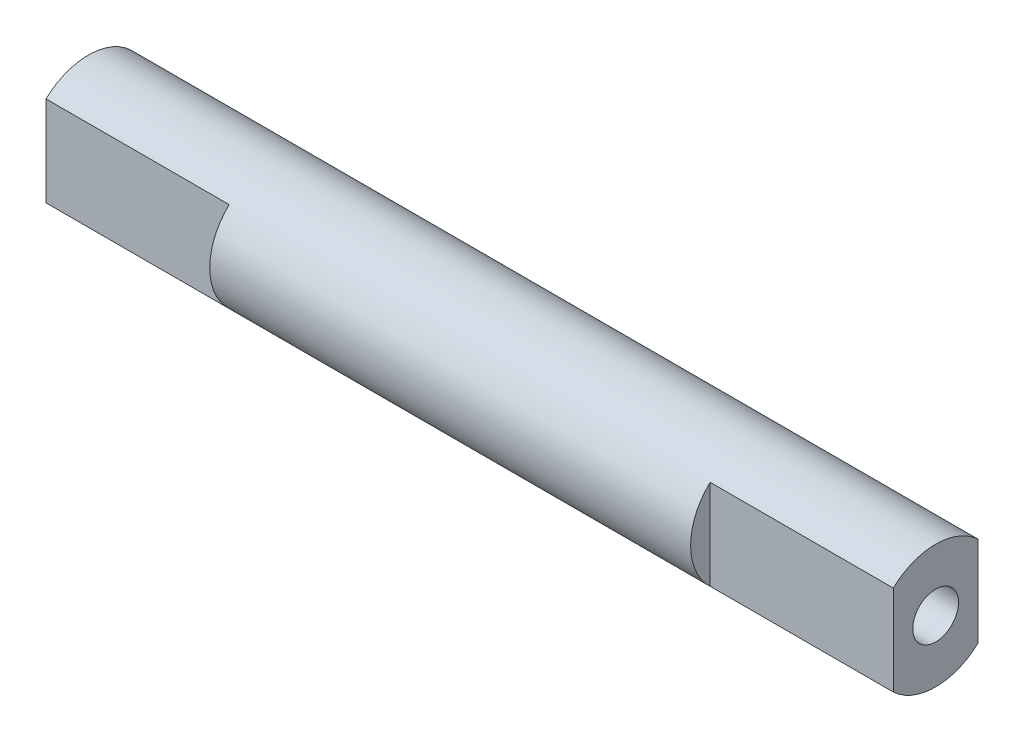
ISO-10303-21;
HEADER;
FILE_DESCRIPTION(('STEP AP214'),'2;1');
FILE_NAME('part.step','',(''),(''),'','','');
FILE_SCHEMA(('AUTOMOTIVE_DESIGN { 1 0 10303 214 1 1 1 1 }'));
ENDSEC;
DATA;
#1=APPLICATION_CONTEXT('core data for automotive mechanical design processes');
#2=APPLICATION_PROTOCOL_DEFINITION('international standard','automotive_design',2000,#1);
#3=PRODUCT_CONTEXT('',#1,'mechanical');
#4=PRODUCT('Part','Part','',(#3));
#5=PRODUCT_RELATED_PRODUCT_CATEGORY('part','',(#4));
#6=PRODUCT_DEFINITION_FORMATION('','',#4);
#7=PRODUCT_DEFINITION_CONTEXT('part definition',#1,'design');
#8=PRODUCT_DEFINITION('design','',#6,#7);
#9=PRODUCT_DEFINITION_SHAPE('','',#8);
#10=(LENGTH_UNIT() NAMED_UNIT(*) SI_UNIT(.MILLI.,.METRE.));
#11=(NAMED_UNIT(*) PLANE_ANGLE_UNIT() SI_UNIT($,.RADIAN.));
#12=(NAMED_UNIT(*) SI_UNIT($,.STERADIAN.) SOLID_ANGLE_UNIT());
#13=UNCERTAINTY_MEASURE_WITH_UNIT(LENGTH_MEASURE(1.E-05),#10,'distance_accuracy_value','');
#14=(GEOMETRIC_REPRESENTATION_CONTEXT(3) GLOBAL_UNCERTAINTY_ASSIGNED_CONTEXT((#13)) GLOBAL_UNIT_ASSIGNED_CONTEXT((#10,
#11,#12)) REPRESENTATION_CONTEXT('',''));
#15=CARTESIAN_POINT('',(0.,0.,0.));
#16=DIRECTION('',(0.,0.,1.));
#17=DIRECTION('',(1.,0.,0.));
#18=AXIS2_PLACEMENT_3D('',#15,#16,#17);
#19=CARTESIAN_POINT('',(18.5,0.,0.));
#20=DIRECTION('',(-1.,0.,0.));
#21=DIRECTION('',(0.,0.,1.));
#22=AXIS2_PLACEMENT_3D('',#19,#20,#21);
#23=CYLINDRICAL_SURFACE('',#22,2.7);
#24=CARTESIAN_POINT('',(18.5,0.,0.));
#25=DIRECTION('',(1.,0.,0.));
#26=DIRECTION('',(0.,0.,-1.));
#27=AXIS2_PLACEMENT_3D('',#24,#25,#26);
#28=CIRCLE('',#27,2.7);
#29=CARTESIAN_POINT('',(18.5,-1.96659604392971,1.85));
#30=VERTEX_POINT('',#29);
#31=CARTESIAN_POINT('',(18.5,-1.96659604392971,-1.85));
#32=VERTEX_POINT('',#31);
#33=EDGE_CURVE('E44',#30,#32,#28,.T.);
#34=ORIENTED_EDGE('',*,*,#33,.F.);
#35=DIRECTION('',(1.,0.,0.));
#36=VECTOR('',#35,1.);
#37=CARTESIAN_POINT('',(10.5,-1.96659604392971,1.85));
#38=LINE('',#37,#36);
#39=CARTESIAN_POINT('',(10.5,-1.96659604392971,1.85));
#40=VERTEX_POINT('',#39);
#41=EDGE_CURVE('E143',#40,#30,#38,.T.);
#42=ORIENTED_EDGE('',*,*,#41,.F.);
#43=CARTESIAN_POINT('',(10.5,0.,0.));
#44=DIRECTION('',(1.,0.,0.));
#45=DIRECTION('',(0.,0.,-1.));
#46=AXIS2_PLACEMENT_3D('',#43,#44,#45);
#47=CIRCLE('',#46,2.7);
#48=CARTESIAN_POINT('',(10.5,1.96659604392971,1.85));
#49=VERTEX_POINT('',#48);
#50=EDGE_CURVE('E137',#49,#40,#47,.T.);
#51=ORIENTED_EDGE('',*,*,#50,.F.);
#52=DIRECTION('',(1.,0.,0.));
#53=VECTOR('',#52,1.);
#54=CARTESIAN_POINT('',(10.5,1.96659604392971,1.85));
#55=LINE('',#54,#53);
#56=CARTESIAN_POINT('',(18.5,1.96659604392971,1.85));
#57=VERTEX_POINT('',#56);
#58=EDGE_CURVE('E146',#49,#57,#55,.T.);
#59=ORIENTED_EDGE('',*,*,#58,.T.);
#60=CARTESIAN_POINT('',(18.5,1.96659604392971,-1.85));
#61=VERTEX_POINT('',#60);
#62=EDGE_CURVE('E11',#61,#57,#28,.T.);
#63=ORIENTED_EDGE('',*,*,#62,.F.);
#64=DIRECTION('',(1.,0.,0.));
#65=VECTOR('',#64,1.);
#66=CARTESIAN_POINT('',(10.5,1.96659604392971,-1.85));
#67=LINE('',#66,#65);
#68=CARTESIAN_POINT('',(10.5,1.96659604392971,-1.85));
#69=VERTEX_POINT('',#68);
#70=EDGE_CURVE('E156',#69,#61,#67,.T.);
#71=ORIENTED_EDGE('',*,*,#70,.F.);
#72=CARTESIAN_POINT('',(10.5,0.,0.));
#73=DIRECTION('',(1.,0.,0.));
#74=DIRECTION('',(0.,0.,-1.));
#75=AXIS2_PLACEMENT_3D('',#72,#73,#74);
#76=CIRCLE('',#75,2.7);
#77=CARTESIAN_POINT('',(10.5,-1.96659604392971,-1.85));
#78=VERTEX_POINT('',#77);
#79=EDGE_CURVE('E151',#78,#69,#76,.T.);
#80=ORIENTED_EDGE('',*,*,#79,.F.);
#81=DIRECTION('',(1.,0.,0.));
#82=VECTOR('',#81,1.);
#83=CARTESIAN_POINT('',(10.5,-1.96659604392971,-1.85));
#84=LINE('',#83,#82);
#85=EDGE_CURVE('E145',#78,#32,#84,.T.);
#86=ORIENTED_EDGE('',*,*,#85,.T.);
#87=EDGE_LOOP('',(#34,#42,#51,#59,#63,#71,#80,#86));
#88=FACE_BOUND('',#87,.T.);
#89=DIRECTION('',(-1.,0.,0.));
#90=VECTOR('',#89,1.);
#91=CARTESIAN_POINT('',(-10.5,1.96659604392971,1.85));
#92=LINE('',#91,#90);
#93=CARTESIAN_POINT('',(-10.5,1.96659604392971,1.85));
#94=VERTEX_POINT('',#93);
#95=CARTESIAN_POINT('',(-18.5,1.96659604392971,1.85));
#96=VERTEX_POINT('',#95);
#97=EDGE_CURVE('E59',#94,#96,#92,.T.);
#98=ORIENTED_EDGE('',*,*,#97,.F.);
#99=CARTESIAN_POINT('',(-10.5,0.,0.));
#100=DIRECTION('',(1.,0.,0.));
#101=DIRECTION('',(0.,0.,-1.));
#102=AXIS2_PLACEMENT_3D('',#99,#100,#101);
#103=CIRCLE('',#102,2.7);
#104=CARTESIAN_POINT('',(-10.5,-1.96659604392971,1.85));
#105=VERTEX_POINT('',#104);
#106=EDGE_CURVE('E106',#94,#105,#103,.T.);
#107=ORIENTED_EDGE('',*,*,#106,.T.);
#108=DIRECTION('',(-1.,0.,0.));
#109=VECTOR('',#108,1.);
#110=CARTESIAN_POINT('',(-10.5,-1.96659604392971,1.85));
#111=LINE('',#110,#109);
#112=CARTESIAN_POINT('',(-18.5,-1.96659604392971,1.85));
#113=VERTEX_POINT('',#112);
#114=EDGE_CURVE('E103',#105,#113,#111,.T.);
#115=ORIENTED_EDGE('',*,*,#114,.T.);
#116=CARTESIAN_POINT('',(-18.5,0.,0.));
#117=DIRECTION('',(1.,0.,0.));
#118=DIRECTION('',(0.,0.,-1.));
#119=AXIS2_PLACEMENT_3D('',#116,#117,#118);
#120=CIRCLE('',#119,2.7);
#121=CARTESIAN_POINT('',(-18.5,-1.96659604392971,-1.85));
#122=VERTEX_POINT('',#121);
#123=EDGE_CURVE('E149',#113,#122,#120,.T.);
#124=ORIENTED_EDGE('',*,*,#123,.T.);
#125=DIRECTION('',(-1.,0.,0.));
#126=VECTOR('',#125,1.);
#127=CARTESIAN_POINT('',(-10.5,-1.96659604392971,-1.85));
#128=LINE('',#127,#126);
#129=CARTESIAN_POINT('',(-10.5,-1.96659604392971,-1.85));
#130=VERTEX_POINT('',#129);
#131=EDGE_CURVE('E51',#130,#122,#128,.T.);
#132=ORIENTED_EDGE('',*,*,#131,.F.);
#133=CARTESIAN_POINT('',(-10.5,0.,0.));
#134=DIRECTION('',(1.,0.,0.));
#135=DIRECTION('',(0.,0.,-1.));
#136=AXIS2_PLACEMENT_3D('',#133,#134,#135);
#137=CIRCLE('',#136,2.7);
#138=CARTESIAN_POINT('',(-10.5,1.96659604392971,-1.85));
#139=VERTEX_POINT('',#138);
#140=EDGE_CURVE('E120',#130,#139,#137,.T.);
#141=ORIENTED_EDGE('',*,*,#140,.T.);
#142=DIRECTION('',(-1.,0.,0.));
#143=VECTOR('',#142,1.);
#144=CARTESIAN_POINT('',(-10.5,1.96659604392971,-1.85));
#145=LINE('',#144,#143);
#146=CARTESIAN_POINT('',(-18.5,1.96659604392971,-1.85));
#147=VERTEX_POINT('',#146);
#148=EDGE_CURVE('E128',#139,#147,#145,.T.);
#149=ORIENTED_EDGE('',*,*,#148,.T.);
#150=EDGE_CURVE('E39',#147,#96,#120,.T.);
#151=ORIENTED_EDGE('',*,*,#150,.T.);
#152=EDGE_LOOP('',(#98,#107,#115,#124,#132,#141,#149,#151));
#153=FACE_BOUND('',#152,.T.);
#154=ADVANCED_FACE('F36',(#88,#153),#23,.T.);
#155=CARTESIAN_POINT('',(-18.5,0.,0.));
#156=DIRECTION('',(1.,0.,0.));
#157=DIRECTION('',(0.,0.,-1.));
#158=AXIS2_PLACEMENT_3D('',#155,#156,#157);
#159=PLANE('',#158);
#160=CARTESIAN_POINT('',(-18.5,0.,0.));
#161=DIRECTION('',(1.,0.,0.));
#162=DIRECTION('',(0.,0.,-1.));
#163=AXIS2_PLACEMENT_3D('',#160,#161,#162);
#164=CIRCLE('',#163,1.);
#165=CARTESIAN_POINT('',(-18.5,0.,-1.));
#166=VERTEX_POINT('',#165);
#167=EDGE_CURVE('E288',#166,#166,#164,.T.);
#168=ORIENTED_EDGE('',*,*,#167,.T.);
#169=EDGE_LOOP('',(#168));
#170=FACE_BOUND('',#169,.T.);
#171=DIRECTION('',(0.,1.,0.));
#172=VECTOR('',#171,1.);
#173=CARTESIAN_POINT('',(-18.5,1.96659604392971,1.85));
#174=LINE('',#173,#172);
#175=EDGE_CURVE('E110',#113,#96,#174,.T.);
#176=ORIENTED_EDGE('',*,*,#175,.T.);
#177=ORIENTED_EDGE('',*,*,#150,.F.);
#178=DIRECTION('',(0.,-1.,0.));
#179=VECTOR('',#178,1.);
#180=CARTESIAN_POINT('',(-18.5,1.96659604392971,-1.85));
#181=LINE('',#180,#179);
#182=EDGE_CURVE('E124',#147,#122,#181,.T.);
#183=ORIENTED_EDGE('',*,*,#182,.T.);
#184=ORIENTED_EDGE('',*,*,#123,.F.);
#185=EDGE_LOOP('',(#176,#177,#183,#184));
#186=FACE_BOUND('',#185,.T.);
#187=ADVANCED_FACE('F193',(#170,#186),#159,.F.);
#188=CARTESIAN_POINT('',(18.5,0.,0.));
#189=DIRECTION('',(1.,0.,0.));
#190=DIRECTION('',(0.,0.,-1.));
#191=AXIS2_PLACEMENT_3D('',#188,#189,#190);
#192=PLANE('',#191);
#193=CARTESIAN_POINT('',(18.5,0.,0.));
#194=DIRECTION('',(1.,0.,0.));
#195=DIRECTION('',(0.,0.,-1.));
#196=AXIS2_PLACEMENT_3D('',#193,#194,#195);
#197=CIRCLE('',#196,1.);
#198=CARTESIAN_POINT('',(18.5,0.,-1.));
#199=VERTEX_POINT('',#198);
#200=EDGE_CURVE('E116',#199,#199,#197,.T.);
#201=ORIENTED_EDGE('',*,*,#200,.F.);
#202=EDGE_LOOP('',(#201));
#203=FACE_BOUND('',#202,.T.);
#204=DIRECTION('',(0.,1.,0.));
#205=VECTOR('',#204,1.);
#206=CARTESIAN_POINT('',(18.5,1.96659604392971,1.85));
#207=LINE('',#206,#205);
#208=EDGE_CURVE('E140',#30,#57,#207,.T.);
#209=ORIENTED_EDGE('',*,*,#208,.F.);
#210=ORIENTED_EDGE('',*,*,#33,.T.);
#211=DIRECTION('',(0.,-1.,0.));
#212=VECTOR('',#211,1.);
#213=CARTESIAN_POINT('',(18.5,1.96659604392971,-1.85));
#214=LINE('',#213,#212);
#215=EDGE_CURVE('E134',#61,#32,#214,.T.);
#216=ORIENTED_EDGE('',*,*,#215,.F.);
#217=ORIENTED_EDGE('',*,*,#62,.T.);
#218=EDGE_LOOP('',(#209,#210,#216,#217));
#219=FACE_BOUND('',#218,.T.);
#220=ADVANCED_FACE('F171',(#203,#219),#192,.T.);
#221=CARTESIAN_POINT('',(10.5,1.96659604392971,-1.85));
#222=DIRECTION('',(0.,0.,1.));
#223=DIRECTION('',(1.,0.,0.));
#224=AXIS2_PLACEMENT_3D('',#221,#222,#223);
#225=PLANE('',#224);
#226=ORIENTED_EDGE('',*,*,#215,.T.);
#227=ORIENTED_EDGE('',*,*,#85,.F.);
#228=DIRECTION('',(0.,-1.,0.));
#229=VECTOR('',#228,1.);
#230=CARTESIAN_POINT('',(10.5,1.96659604392971,-1.85));
#231=LINE('',#230,#229);
#232=EDGE_CURVE('E153',#69,#78,#231,.T.);
#233=ORIENTED_EDGE('',*,*,#232,.F.);
#234=ORIENTED_EDGE('',*,*,#70,.T.);
#235=EDGE_LOOP('',(#226,#227,#233,#234));
#236=FACE_BOUND('',#235,.T.);
#237=ADVANCED_FACE('F164',(#236),#225,.F.);
#238=CARTESIAN_POINT('',(10.5,0.,0.));
#239=DIRECTION('',(1.,0.,0.));
#240=DIRECTION('',(0.,0.,-1.));
#241=AXIS2_PLACEMENT_3D('',#238,#239,#240);
#242=PLANE('',#241);
#243=ORIENTED_EDGE('',*,*,#79,.T.);
#244=ORIENTED_EDGE('',*,*,#232,.T.);
#245=EDGE_LOOP('',(#243,#244));
#246=FACE_BOUND('',#245,.T.);
#247=ADVANCED_FACE('F190',(#246),#242,.T.);
#248=CARTESIAN_POINT('',(10.5,1.96659604392971,1.85));
#249=DIRECTION('',(0.,0.,-1.));
#250=DIRECTION('',(-1.,0.,0.));
#251=AXIS2_PLACEMENT_3D('',#248,#249,#250);
#252=PLANE('',#251);
#253=ORIENTED_EDGE('',*,*,#208,.T.);
#254=ORIENTED_EDGE('',*,*,#58,.F.);
#255=DIRECTION('',(0.,1.,0.));
#256=VECTOR('',#255,1.);
#257=CARTESIAN_POINT('',(10.5,1.96659604392971,1.85));
#258=LINE('',#257,#256);
#259=EDGE_CURVE('E139',#40,#49,#258,.T.);
#260=ORIENTED_EDGE('',*,*,#259,.F.);
#261=ORIENTED_EDGE('',*,*,#41,.T.);
#262=EDGE_LOOP('',(#253,#254,#260,#261));
#263=FACE_BOUND('',#262,.T.);
#264=ADVANCED_FACE('F177',(#263),#252,.F.);
#265=CARTESIAN_POINT('',(10.5,0.,0.));
#266=DIRECTION('',(1.,0.,0.));
#267=DIRECTION('',(0.,0.,-1.));
#268=AXIS2_PLACEMENT_3D('',#265,#266,#267);
#269=PLANE('',#268);
#270=ORIENTED_EDGE('',*,*,#50,.T.);
#271=ORIENTED_EDGE('',*,*,#259,.T.);
#272=EDGE_LOOP('',(#270,#271));
#273=FACE_BOUND('',#272,.T.);
#274=ADVANCED_FACE('F179',(#273),#269,.T.);
#275=CARTESIAN_POINT('',(12.5,0.,0.));
#276=DIRECTION('',(1.,0.,0.));
#277=DIRECTION('',(0.,0.,-1.));
#278=AXIS2_PLACEMENT_3D('',#275,#276,#277);
#279=CYLINDRICAL_SURFACE('',#278,1.);
#280=CARTESIAN_POINT('',(12.5,0.,0.));
#281=DIRECTION('',(1.,0.,0.));
#282=DIRECTION('',(0.,0.,-1.));
#283=AXIS2_PLACEMENT_3D('',#280,#281,#282);
#284=CIRCLE('',#283,1.);
#285=CARTESIAN_POINT('',(12.5,0.,-1.));
#286=VERTEX_POINT('',#285);
#287=EDGE_CURVE('E131',#286,#286,#284,.T.);
#288=ORIENTED_EDGE('',*,*,#287,.F.);
#289=EDGE_LOOP('',(#288));
#290=FACE_BOUND('',#289,.T.);
#291=ORIENTED_EDGE('',*,*,#200,.T.);
#292=EDGE_LOOP('',(#291));
#293=FACE_BOUND('',#292,.T.);
#294=ADVANCED_FACE('F181',(#290,#293),#279,.F.);
#295=CARTESIAN_POINT('',(12.5,0.,0.));
#296=DIRECTION('',(1.,0.,0.));
#297=DIRECTION('',(0.,0.,-1.));
#298=AXIS2_PLACEMENT_3D('',#295,#296,#297);
#299=PLANE('',#298);
#300=ORIENTED_EDGE('',*,*,#287,.T.);
#301=EDGE_LOOP('',(#300));
#302=FACE_BOUND('',#301,.T.);
#303=ADVANCED_FACE('F187',(#302),#299,.T.);
#304=CARTESIAN_POINT('',(-10.5,1.96659604392971,-1.85));
#305=DIRECTION('',(0.,0.,-1.));
#306=DIRECTION('',(-1.,0.,0.));
#307=AXIS2_PLACEMENT_3D('',#304,#305,#306);
#308=PLANE('',#307);
#309=ORIENTED_EDGE('',*,*,#182,.F.);
#310=ORIENTED_EDGE('',*,*,#148,.F.);
#311=DIRECTION('',(0.,-1.,0.));
#312=VECTOR('',#311,1.);
#313=CARTESIAN_POINT('',(-10.5,1.96659604392971,-1.85));
#314=LINE('',#313,#312);
#315=EDGE_CURVE('E123',#139,#130,#314,.T.);
#316=ORIENTED_EDGE('',*,*,#315,.T.);
#317=ORIENTED_EDGE('',*,*,#131,.T.);
#318=EDGE_LOOP('',(#309,#310,#316,#317));
#319=FACE_BOUND('',#318,.T.);
#320=ADVANCED_FACE('F215',(#319),#308,.T.);
#321=CARTESIAN_POINT('',(-10.5,0.,0.));
#322=DIRECTION('',(-1.,0.,0.));
#323=DIRECTION('',(0.,0.,-1.));
#324=AXIS2_PLACEMENT_3D('',#321,#322,#323);
#325=PLANE('',#324);
#326=ORIENTED_EDGE('',*,*,#140,.F.);
#327=ORIENTED_EDGE('',*,*,#315,.F.);
#328=EDGE_LOOP('',(#326,#327));
#329=FACE_BOUND('',#328,.T.);
#330=ADVANCED_FACE('F218',(#329),#325,.T.);
#331=CARTESIAN_POINT('',(-10.5,1.96659604392971,1.85));
#332=DIRECTION('',(0.,0.,1.));
#333=DIRECTION('',(1.,0.,0.));
#334=AXIS2_PLACEMENT_3D('',#331,#332,#333);
#335=PLANE('',#334);
#336=ORIENTED_EDGE('',*,*,#175,.F.);
#337=ORIENTED_EDGE('',*,*,#114,.F.);
#338=DIRECTION('',(0.,1.,0.));
#339=VECTOR('',#338,1.);
#340=CARTESIAN_POINT('',(-10.5,1.96659604392971,1.85));
#341=LINE('',#340,#339);
#342=EDGE_CURVE('E99',#105,#94,#341,.T.);
#343=ORIENTED_EDGE('',*,*,#342,.T.);
#344=ORIENTED_EDGE('',*,*,#97,.T.);
#345=EDGE_LOOP('',(#336,#337,#343,#344));
#346=FACE_BOUND('',#345,.T.);
#347=ADVANCED_FACE('F101',(#346),#335,.T.);
#348=CARTESIAN_POINT('',(-10.5,0.,0.));
#349=DIRECTION('',(-1.,0.,0.));
#350=DIRECTION('',(0.,0.,-1.));
#351=AXIS2_PLACEMENT_3D('',#348,#349,#350);
#352=PLANE('',#351);
#353=ORIENTED_EDGE('',*,*,#106,.F.);
#354=ORIENTED_EDGE('',*,*,#342,.F.);
#355=EDGE_LOOP('',(#353,#354));
#356=FACE_BOUND('',#355,.T.);
#357=ADVANCED_FACE('F108',(#356),#352,.T.);
#358=CARTESIAN_POINT('',(-12.5,0.,0.));
#359=DIRECTION('',(-1.,0.,0.));
#360=DIRECTION('',(0.,0.,1.));
#361=AXIS2_PLACEMENT_3D('',#358,#359,#360);
#362=CYLINDRICAL_SURFACE('',#361,1.);
#363=CARTESIAN_POINT('',(-12.5,0.,0.));
#364=DIRECTION('',(1.,0.,0.));
#365=DIRECTION('',(0.,0.,-1.));
#366=AXIS2_PLACEMENT_3D('',#363,#364,#365);
#367=CIRCLE('',#366,1.);
#368=CARTESIAN_POINT('',(-12.5,0.,-1.));
#369=VERTEX_POINT('',#368);
#370=EDGE_CURVE('E127',#369,#369,#367,.T.);
#371=ORIENTED_EDGE('',*,*,#370,.T.);
#372=EDGE_LOOP('',(#371));
#373=FACE_BOUND('',#372,.T.);
#374=ORIENTED_EDGE('',*,*,#167,.F.);
#375=EDGE_LOOP('',(#374));
#376=FACE_BOUND('',#375,.T.);
#377=ADVANCED_FACE('F264',(#373,#376),#362,.F.);
#378=CARTESIAN_POINT('',(-12.5,0.,0.));
#379=DIRECTION('',(-1.,0.,0.));
#380=DIRECTION('',(0.,0.,-1.));
#381=AXIS2_PLACEMENT_3D('',#378,#379,#380);
#382=PLANE('',#381);
#383=ORIENTED_EDGE('',*,*,#370,.F.);
#384=EDGE_LOOP('',(#383));
#385=FACE_BOUND('',#384,.T.);
#386=ADVANCED_FACE('F272',(#385),#382,.T.);
#387=CLOSED_SHELL('',(#154,#187,#220,#237,#247,#264,#274,#294,#303,#320,#330,#347,#357,#377,#386));
#388=MANIFOLD_SOLID_BREP('B2',#387);
#389=ADVANCED_BREP_SHAPE_REPRESENTATION('',(#18,#388),#14);
#390=SHAPE_DEFINITION_REPRESENTATION(#9,#389);
ENDSEC;
END-ISO-10303-21;
